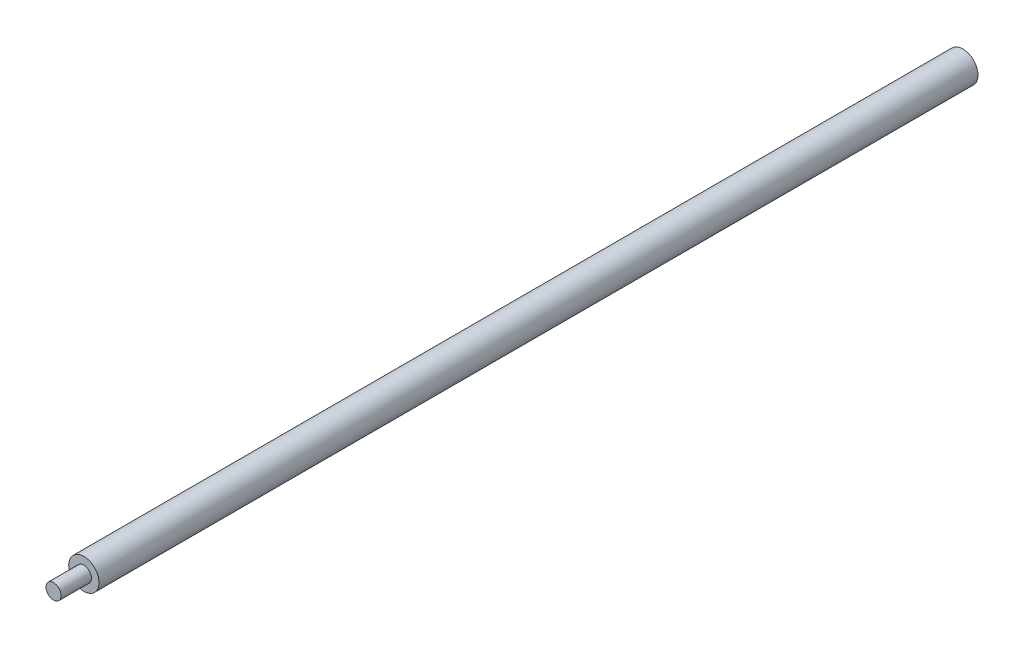
ISO-10303-21;
HEADER;
FILE_DESCRIPTION(('STEP AP214'),'2;1');
FILE_NAME('part.step','',(''),(''),'','','');
FILE_SCHEMA(('AUTOMOTIVE_DESIGN { 1 0 10303 214 1 1 1 1 }'));
ENDSEC;
DATA;
#1=APPLICATION_CONTEXT('core data for automotive mechanical design processes');
#2=APPLICATION_PROTOCOL_DEFINITION('international standard','automotive_design',2000,#1);
#3=PRODUCT_CONTEXT('',#1,'mechanical');
#4=PRODUCT('Part','Part','',(#3));
#5=PRODUCT_RELATED_PRODUCT_CATEGORY('part','',(#4));
#6=PRODUCT_DEFINITION_FORMATION('','',#4);
#7=PRODUCT_DEFINITION_CONTEXT('part definition',#1,'design');
#8=PRODUCT_DEFINITION('design','',#6,#7);
#9=PRODUCT_DEFINITION_SHAPE('','',#8);
#10=(LENGTH_UNIT() NAMED_UNIT(*) SI_UNIT(.MILLI.,.METRE.));
#11=(NAMED_UNIT(*) PLANE_ANGLE_UNIT() SI_UNIT($,.RADIAN.));
#12=(NAMED_UNIT(*) SI_UNIT($,.STERADIAN.) SOLID_ANGLE_UNIT());
#13=UNCERTAINTY_MEASURE_WITH_UNIT(LENGTH_MEASURE(1.E-05),#10,'distance_accuracy_value','');
#14=(GEOMETRIC_REPRESENTATION_CONTEXT(3) GLOBAL_UNCERTAINTY_ASSIGNED_CONTEXT((#13)) GLOBAL_UNIT_ASSIGNED_CONTEXT((#10,
#11,#12)) REPRESENTATION_CONTEXT('',''));
#15=CARTESIAN_POINT('',(0.,0.,0.));
#16=DIRECTION('',(0.,0.,1.));
#17=DIRECTION('',(1.,0.,0.));
#18=AXIS2_PLACEMENT_3D('',#15,#16,#17);
#19=CARTESIAN_POINT('',(0.,0.,145.));
#20=DIRECTION('',(0.,0.,-1.));
#21=DIRECTION('',(-1.,0.,0.));
#22=AXIS2_PLACEMENT_3D('',#19,#20,#21);
#23=CYLINDRICAL_SURFACE('',#22,2.5);
#24=CARTESIAN_POINT('',(0.,0.,145.));
#25=DIRECTION('',(0.,0.,1.));
#26=DIRECTION('',(1.,0.,0.));
#27=AXIS2_PLACEMENT_3D('',#24,#25,#26);
#28=CIRCLE('',#27,2.5);
#29=CARTESIAN_POINT('',(2.5,0.,145.));
#30=VERTEX_POINT('',#29);
#31=EDGE_CURVE('E45',#30,#30,#28,.T.);
#32=ORIENTED_EDGE('',*,*,#31,.F.);
#33=EDGE_LOOP('',(#32));
#34=FACE_BOUND('',#33,.T.);
#35=CARTESIAN_POINT('',(0.,0.,0.));
#36=DIRECTION('',(0.,0.,1.));
#37=DIRECTION('',(1.,0.,0.));
#38=AXIS2_PLACEMENT_3D('',#35,#36,#37);
#39=CIRCLE('',#38,2.5);
#40=CARTESIAN_POINT('',(2.5,0.,0.));
#41=VERTEX_POINT('',#40);
#42=EDGE_CURVE('E40',#41,#41,#39,.T.);
#43=ORIENTED_EDGE('',*,*,#42,.T.);
#44=EDGE_LOOP('',(#43));
#45=FACE_BOUND('',#44,.T.);
#46=ADVANCED_FACE('F37',(#34,#45),#23,.T.);
#47=CARTESIAN_POINT('',(0.,0.,145.));
#48=DIRECTION('',(0.,0.,1.));
#49=DIRECTION('',(1.,0.,0.));
#50=AXIS2_PLACEMENT_3D('',#47,#48,#49);
#51=PLANE('',#50);
#52=CARTESIAN_POINT('',(0.,0.,145.));
#53=DIRECTION('',(0.,0.,1.));
#54=DIRECTION('',(1.,0.,0.));
#55=AXIS2_PLACEMENT_3D('',#52,#53,#54);
#56=CIRCLE('',#55,1.25);
#57=CARTESIAN_POINT('',(1.25,0.,145.));
#58=VERTEX_POINT('',#57);
#59=EDGE_CURVE('E10',#58,#58,#56,.T.);
#60=ORIENTED_EDGE('',*,*,#59,.F.);
#61=EDGE_LOOP('',(#60));
#62=FACE_BOUND('',#61,.T.);
#63=ORIENTED_EDGE('',*,*,#31,.T.);
#64=EDGE_LOOP('',(#63));
#65=FACE_BOUND('',#64,.T.);
#66=ADVANCED_FACE('F78',(#62,#65),#51,.T.);
#67=CARTESIAN_POINT('',(0.,0.,0.));
#68=DIRECTION('',(0.,0.,1.));
#69=DIRECTION('',(1.,0.,0.));
#70=AXIS2_PLACEMENT_3D('',#67,#68,#69);
#71=PLANE('',#70);
#72=CARTESIAN_POINT('',(0.,0.,0.));
#73=DIRECTION('',(0.,0.,-1.));
#74=DIRECTION('',(-1.,0.,0.));
#75=AXIS2_PLACEMENT_3D('',#72,#73,#74);
#76=CIRCLE('',#75,1.25);
#77=CARTESIAN_POINT('',(-1.25,0.,0.));
#78=VERTEX_POINT('',#77);
#79=EDGE_CURVE('E57',#78,#78,#76,.T.);
#80=ORIENTED_EDGE('',*,*,#79,.F.);
#81=EDGE_LOOP('',(#80));
#82=FACE_BOUND('',#81,.T.);
#83=ORIENTED_EDGE('',*,*,#42,.F.);
#84=EDGE_LOOP('',(#83));
#85=FACE_BOUND('',#84,.T.);
#86=ADVANCED_FACE('F74',(#82,#85),#71,.F.);
#87=CARTESIAN_POINT('',(0.,0.,150.));
#88=DIRECTION('',(0.,0.,-1.));
#89=DIRECTION('',(-1.,0.,0.));
#90=AXIS2_PLACEMENT_3D('',#87,#88,#89);
#91=CYLINDRICAL_SURFACE('',#90,1.25);
#92=CARTESIAN_POINT('',(0.,0.,150.));
#93=DIRECTION('',(0.,0.,1.));
#94=DIRECTION('',(1.,0.,0.));
#95=AXIS2_PLACEMENT_3D('',#92,#93,#94);
#96=CIRCLE('',#95,1.25);
#97=CARTESIAN_POINT('',(1.25,0.,150.));
#98=VERTEX_POINT('',#97);
#99=EDGE_CURVE('E52',#98,#98,#96,.T.);
#100=ORIENTED_EDGE('',*,*,#99,.F.);
#101=EDGE_LOOP('',(#100));
#102=FACE_BOUND('',#101,.T.);
#103=ORIENTED_EDGE('',*,*,#59,.T.);
#104=EDGE_LOOP('',(#103));
#105=FACE_BOUND('',#104,.T.);
#106=ADVANCED_FACE('F77',(#102,#105),#91,.T.);
#107=CARTESIAN_POINT('',(0.,0.,150.));
#108=DIRECTION('',(0.,0.,1.));
#109=DIRECTION('',(1.,0.,0.));
#110=AXIS2_PLACEMENT_3D('',#107,#108,#109);
#111=PLANE('',#110);
#112=ORIENTED_EDGE('',*,*,#99,.T.);
#113=EDGE_LOOP('',(#112));
#114=FACE_BOUND('',#113,.T.);
#115=ADVANCED_FACE('F70',(#114),#111,.T.);
#116=CARTESIAN_POINT('',(0.,0.,5.));
#117=DIRECTION('',(0.,0.,-1.));
#118=DIRECTION('',(-1.,0.,0.));
#119=AXIS2_PLACEMENT_3D('',#116,#117,#118);
#120=CYLINDRICAL_SURFACE('',#119,1.25);
#121=CARTESIAN_POINT('',(0.,0.,5.));
#122=DIRECTION('',(0.,0.,-1.));
#123=DIRECTION('',(-1.,0.,0.));
#124=AXIS2_PLACEMENT_3D('',#121,#122,#123);
#125=CIRCLE('',#124,1.25);
#126=CARTESIAN_POINT('',(-1.25,0.,5.));
#127=VERTEX_POINT('',#126);
#128=EDGE_CURVE('E56',#127,#127,#125,.T.);
#129=ORIENTED_EDGE('',*,*,#128,.F.);
#130=EDGE_LOOP('',(#129));
#131=FACE_BOUND('',#130,.T.);
#132=ORIENTED_EDGE('',*,*,#79,.T.);
#133=EDGE_LOOP('',(#132));
#134=FACE_BOUND('',#133,.T.);
#135=ADVANCED_FACE('F67',(#131,#134),#120,.F.);
#136=CARTESIAN_POINT('',(0.,0.,5.));
#137=DIRECTION('',(0.,0.,-1.));
#138=DIRECTION('',(-1.,0.,0.));
#139=AXIS2_PLACEMENT_3D('',#136,#137,#138);
#140=PLANE('',#139);
#141=ORIENTED_EDGE('',*,*,#128,.T.);
#142=EDGE_LOOP('',(#141));
#143=FACE_BOUND('',#142,.T.);
#144=ADVANCED_FACE('F65',(#143),#140,.T.);
#145=CLOSED_SHELL('',(#46,#66,#86,#106,#115,#135,#144));
#146=MANIFOLD_SOLID_BREP('B2',#145);
#147=ADVANCED_BREP_SHAPE_REPRESENTATION('',(#18,#146),#14);
#148=SHAPE_DEFINITION_REPRESENTATION(#9,#147);
ENDSEC;
END-ISO-10303-21;
